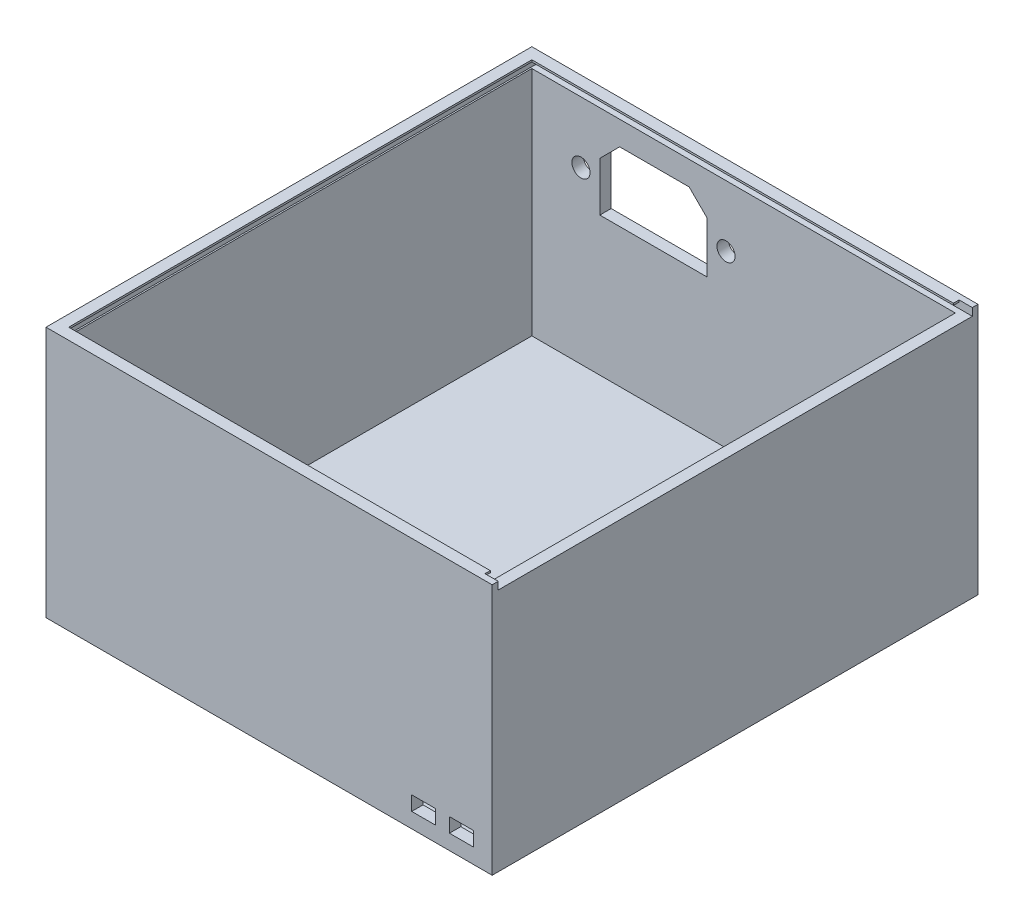
ISO-10303-21;
HEADER;
FILE_DESCRIPTION(('STEP AP214'),'2;1');
FILE_NAME('part.step','',(''),(''),'','','');
FILE_SCHEMA(('AUTOMOTIVE_DESIGN { 1 0 10303 214 1 1 1 1 }'));
ENDSEC;
DATA;
#1=APPLICATION_CONTEXT('core data for automotive mechanical design processes');
#2=APPLICATION_PROTOCOL_DEFINITION('international standard','automotive_design',2000,#1);
#3=PRODUCT_CONTEXT('',#1,'mechanical');
#4=PRODUCT('Part','Part','',(#3));
#5=PRODUCT_RELATED_PRODUCT_CATEGORY('part','',(#4));
#6=PRODUCT_DEFINITION_FORMATION('','',#4);
#7=PRODUCT_DEFINITION_CONTEXT('part definition',#1,'design');
#8=PRODUCT_DEFINITION('design','',#6,#7);
#9=PRODUCT_DEFINITION_SHAPE('','',#8);
#10=(LENGTH_UNIT() NAMED_UNIT(*) SI_UNIT(.MILLI.,.METRE.));
#11=(NAMED_UNIT(*) PLANE_ANGLE_UNIT() SI_UNIT($,.RADIAN.));
#12=(NAMED_UNIT(*) SI_UNIT($,.STERADIAN.) SOLID_ANGLE_UNIT());
#13=UNCERTAINTY_MEASURE_WITH_UNIT(LENGTH_MEASURE(1.E-05),#10,'distance_accuracy_value','');
#14=(GEOMETRIC_REPRESENTATION_CONTEXT(3) GLOBAL_UNCERTAINTY_ASSIGNED_CONTEXT((#13)) GLOBAL_UNIT_ASSIGNED_CONTEXT((#10,
#11,#12)) REPRESENTATION_CONTEXT('',''));
#15=CARTESIAN_POINT('',(0.,0.,0.));
#16=DIRECTION('',(0.,0.,1.));
#17=DIRECTION('',(1.,0.,0.));
#18=AXIS2_PLACEMENT_3D('',#15,#16,#17);
#19=CARTESIAN_POINT('',(56.05,3.3,-61.3));
#20=DIRECTION('',(0.,0.,-1.));
#21=DIRECTION('',(-1.,0.,0.));
#22=AXIS2_PLACEMENT_3D('',#19,#20,#21);
#23=PLANE('',#22);
#24=DIRECTION('',(1.,0.,0.));
#25=VECTOR('',#24,1.);
#26=CARTESIAN_POINT('',(56.05,66.0999999999999,-61.3));
#27=LINE('',#26,#25);
#28=CARTESIAN_POINT('',(-56.05,66.0999999999999,-61.3));
#29=VERTEX_POINT('',#28);
#30=CARTESIAN_POINT('',(55.55,66.0999999999999,-61.3));
#31=VERTEX_POINT('',#30);
#32=EDGE_CURVE('E342',#29,#31,#27,.T.);
#33=ORIENTED_EDGE('',*,*,#32,.T.);
#34=DIRECTION('',(0.,1.,0.));
#35=VECTOR('',#34,1.);
#36=CARTESIAN_POINT('',(55.55,3.3,-61.3));
#37=LINE('',#36,#35);
#38=CARTESIAN_POINT('',(55.55,66.6,-61.3));
#39=VERTEX_POINT('',#38);
#40=EDGE_CURVE('E54',#31,#39,#37,.T.);
#41=ORIENTED_EDGE('',*,*,#40,.T.);
#42=DIRECTION('',(-1.,0.,0.));
#43=VECTOR('',#42,1.);
#44=CARTESIAN_POINT('',(56.05,66.6,-61.3));
#45=LINE('',#44,#43);
#46=CARTESIAN_POINT('',(-56.05,66.6,-61.3));
#47=VERTEX_POINT('',#46);
#48=EDGE_CURVE('E270',#39,#47,#45,.T.);
#49=ORIENTED_EDGE('',*,*,#48,.T.);
#50=DIRECTION('',(0.,1.,0.));
#51=VECTOR('',#50,1.);
#52=CARTESIAN_POINT('',(-56.05,3.3,-61.3));
#53=LINE('',#52,#51);
#54=EDGE_CURVE('E387',#29,#47,#53,.T.);
#55=ORIENTED_EDGE('',*,*,#54,.F.);
#56=EDGE_LOOP('',(#33,#41,#49,#55));
#57=FACE_BOUND('',#56,.T.);
#58=ADVANCED_FACE('F38',(#57),#23,.F.);
#59=CARTESIAN_POINT('',(-56.05,3.3,61.3));
#60=DIRECTION('',(0.,0.,1.));
#61=DIRECTION('',(1.,0.,0.));
#62=AXIS2_PLACEMENT_3D('',#59,#60,#61);
#63=PLANE('',#62);
#64=DIRECTION('',(1.,0.,0.));
#65=VECTOR('',#64,1.);
#66=CARTESIAN_POINT('',(-56.05,66.6,61.3));
#67=LINE('',#66,#65);
#68=CARTESIAN_POINT('',(-56.05,66.6,61.3));
#69=VERTEX_POINT('',#68);
#70=CARTESIAN_POINT('',(55.55,66.6,61.3));
#71=VERTEX_POINT('',#70);
#72=EDGE_CURVE('E350',#69,#71,#67,.T.);
#73=ORIENTED_EDGE('',*,*,#72,.T.);
#74=DIRECTION('',(0.,-1.,0.));
#75=VECTOR('',#74,1.);
#76=CARTESIAN_POINT('',(55.55,3.3,61.3));
#77=LINE('',#76,#75);
#78=CARTESIAN_POINT('',(55.55,66.1,61.3));
#79=VERTEX_POINT('',#78);
#80=EDGE_CURVE('E282',#71,#79,#77,.T.);
#81=ORIENTED_EDGE('',*,*,#80,.T.);
#82=DIRECTION('',(-1.,0.,0.));
#83=VECTOR('',#82,1.);
#84=CARTESIAN_POINT('',(-56.05,66.1,61.3));
#85=LINE('',#84,#83);
#86=CARTESIAN_POINT('',(-56.05,66.1,61.3));
#87=VERTEX_POINT('',#86);
#88=EDGE_CURVE('E339',#79,#87,#85,.T.);
#89=ORIENTED_EDGE('',*,*,#88,.T.);
#90=DIRECTION('',(0.,1.,0.));
#91=VECTOR('',#90,1.);
#92=CARTESIAN_POINT('',(-56.05,3.3,61.3));
#93=LINE('',#92,#91);
#94=EDGE_CURVE('E382',#87,#69,#93,.T.);
#95=ORIENTED_EDGE('',*,*,#94,.T.);
#96=EDGE_LOOP('',(#73,#81,#89,#95));
#97=FACE_BOUND('',#96,.T.);
#98=ADVANCED_FACE('F659',(#97),#63,.F.);
#99=CARTESIAN_POINT('',(-56.05,3.3,-61.3));
#100=DIRECTION('',(-1.,0.,0.));
#101=DIRECTION('',(0.,0.,1.));
#102=AXIS2_PLACEMENT_3D('',#99,#100,#101);
#103=PLANE('',#102);
#104=ORIENTED_EDGE('',*,*,#94,.F.);
#105=DIRECTION('',(0.,0.,-1.));
#106=VECTOR('',#105,1.);
#107=CARTESIAN_POINT('',(-56.05,66.0999999999999,-61.3));
#108=LINE('',#107,#106);
#109=EDGE_CURVE('E346',#87,#29,#108,.T.);
#110=ORIENTED_EDGE('',*,*,#109,.T.);
#111=ORIENTED_EDGE('',*,*,#54,.T.);
#112=DIRECTION('',(0.,0.,1.));
#113=VECTOR('',#112,1.);
#114=CARTESIAN_POINT('',(-56.05,66.6,-61.3));
#115=LINE('',#114,#113);
#116=EDGE_CURVE('E356',#47,#69,#115,.T.);
#117=ORIENTED_EDGE('',*,*,#116,.T.);
#118=EDGE_LOOP('',(#104,#110,#111,#117));
#119=FACE_BOUND('',#118,.T.);
#120=ADVANCED_FACE('F665',(#119),#103,.F.);
#121=CARTESIAN_POINT('',(59.05,66.6,-64.3));
#122=DIRECTION('',(-1.,0.,0.));
#123=DIRECTION('',(0.,0.,1.));
#124=AXIS2_PLACEMENT_3D('',#121,#122,#123);
#125=PLANE('',#124);
#126=DIRECTION('',(0.,-1.,0.));
#127=VECTOR('',#126,1.);
#128=CARTESIAN_POINT('',(59.05,64.5999999999999,62.7));
#129=LINE('',#128,#127);
#130=CARTESIAN_POINT('',(59.05,66.6,62.7));
#131=VERTEX_POINT('',#130);
#132=CARTESIAN_POINT('',(59.05,64.5999999999999,62.7));
#133=VERTEX_POINT('',#132);
#134=EDGE_CURVE('E288',#131,#133,#129,.T.);
#135=ORIENTED_EDGE('',*,*,#134,.F.);
#136=DIRECTION('',(0.,0.,-1.));
#137=VECTOR('',#136,1.);
#138=CARTESIAN_POINT('',(59.05,66.6,-64.3));
#139=LINE('',#138,#137);
#140=CARTESIAN_POINT('',(59.05,66.6,64.3));
#141=VERTEX_POINT('',#140);
#142=EDGE_CURVE('E558',#141,#131,#139,.T.);
#143=ORIENTED_EDGE('',*,*,#142,.F.);
#144=DIRECTION('',(0.,-1.,0.));
#145=VECTOR('',#144,1.);
#146=CARTESIAN_POINT('',(59.05,66.6,64.3));
#147=LINE('',#146,#145);
#148=CARTESIAN_POINT('',(59.05,0.,64.3));
#149=VERTEX_POINT('',#148);
#150=EDGE_CURVE('E572',#141,#149,#147,.T.);
#151=ORIENTED_EDGE('',*,*,#150,.T.);
#152=DIRECTION('',(0.,0.,-1.));
#153=VECTOR('',#152,1.);
#154=CARTESIAN_POINT('',(59.05,0.,-64.3));
#155=LINE('',#154,#153);
#156=CARTESIAN_POINT('',(59.05,0.,-64.3));
#157=VERTEX_POINT('',#156);
#158=EDGE_CURVE('E543',#149,#157,#155,.T.);
#159=ORIENTED_EDGE('',*,*,#158,.T.);
#160=DIRECTION('',(0.,-1.,0.));
#161=VECTOR('',#160,1.);
#162=CARTESIAN_POINT('',(59.05,66.6,-64.3));
#163=LINE('',#162,#161);
#164=CARTESIAN_POINT('',(59.05,66.6,-64.3));
#165=VERTEX_POINT('',#164);
#166=EDGE_CURVE('E596',#165,#157,#163,.T.);
#167=ORIENTED_EDGE('',*,*,#166,.F.);
#168=CARTESIAN_POINT('',(59.05,66.6,-62.8));
#169=VERTEX_POINT('',#168);
#170=EDGE_CURVE('E563',#169,#165,#139,.T.);
#171=ORIENTED_EDGE('',*,*,#170,.F.);
#172=DIRECTION('',(0.,1.,0.));
#173=VECTOR('',#172,1.);
#174=CARTESIAN_POINT('',(59.05,64.5999999999999,-62.8));
#175=LINE('',#174,#173);
#176=CARTESIAN_POINT('',(59.05,64.5999999999999,-62.8));
#177=VERTEX_POINT('',#176);
#178=EDGE_CURVE('E261',#177,#169,#175,.T.);
#179=ORIENTED_EDGE('',*,*,#178,.F.);
#180=DIRECTION('',(0.,0.,-1.));
#181=VECTOR('',#180,1.);
#182=CARTESIAN_POINT('',(59.05,64.5999999999999,62.7));
#183=LINE('',#182,#181);
#184=EDGE_CURVE('E308',#133,#177,#183,.T.);
#185=ORIENTED_EDGE('',*,*,#184,.F.);
#186=EDGE_LOOP('',(#135,#143,#151,#159,#167,#171,#179,#185));
#187=FACE_BOUND('',#186,.T.);
#188=ADVANCED_FACE('F40',(#187),#125,.F.);
#189=CARTESIAN_POINT('',(-59.05,66.6,-64.3));
#190=DIRECTION('',(0.,0.,1.));
#191=DIRECTION('',(1.,0.,0.));
#192=AXIS2_PLACEMENT_3D('',#189,#190,#191);
#193=PLANE('',#192);
#194=CARTESIAN_POINT('',(-4.65000000000013,48.4,-64.3));
#195=DIRECTION('',(0.,0.,-1.));
#196=DIRECTION('',(-1.,0.,0.));
#197=AXIS2_PLACEMENT_3D('',#194,#195,#196);
#198=CIRCLE('',#197,2.4);
#199=CARTESIAN_POINT('',(-7.05000000000013,48.4,-64.3));
#200=VERTEX_POINT('',#199);
#201=EDGE_CURVE('E473',#200,#200,#198,.T.);
#202=ORIENTED_EDGE('',*,*,#201,.F.);
#203=EDGE_LOOP('',(#202));
#204=FACE_BOUND('',#203,.T.);
#205=CARTESIAN_POINT('',(-43.05,48.4,-64.3));
#206=DIRECTION('',(0.,0.,-1.));
#207=DIRECTION('',(-1.,0.,0.));
#208=AXIS2_PLACEMENT_3D('',#205,#206,#207);
#209=CIRCLE('',#208,2.40000000000001);
#210=CARTESIAN_POINT('',(-45.45,48.4,-64.3));
#211=VERTEX_POINT('',#210);
#212=EDGE_CURVE('E508',#211,#211,#209,.T.);
#213=ORIENTED_EDGE('',*,*,#212,.F.);
#214=EDGE_LOOP('',(#213));
#215=FACE_BOUND('',#214,.T.);
#216=DIRECTION('',(-1.,0.,0.));
#217=VECTOR('',#216,1.);
#218=CARTESIAN_POINT('',(-9.65000000000013,40.,-64.3));
#219=LINE('',#218,#217);
#220=CARTESIAN_POINT('',(-9.65000000000013,40.,-64.3));
#221=VERTEX_POINT('',#220);
#222=CARTESIAN_POINT('',(-38.05,40.,-64.3));
#223=VERTEX_POINT('',#222);
#224=EDGE_CURVE('E519',#221,#223,#219,.T.);
#225=ORIENTED_EDGE('',*,*,#224,.F.);
#226=DIRECTION('',(0.,-1.,0.));
#227=VECTOR('',#226,1.);
#228=CARTESIAN_POINT('',(-9.65000000000013,40.,-64.3));
#229=LINE('',#228,#227);
#230=CARTESIAN_POINT('',(-9.65000000000013,53.5169600949815,-64.3));
#231=VERTEX_POINT('',#230);
#232=EDGE_CURVE('E512',#231,#221,#229,.T.);
#233=ORIENTED_EDGE('',*,*,#232,.F.);
#234=DIRECTION('',(0.707106781186549,-0.707106781186546,0.));
#235=VECTOR('',#234,1.);
#236=CARTESIAN_POINT('',(-14.4000000000001,58.2669600949815,-64.3));
#237=LINE('',#236,#235);
#238=CARTESIAN_POINT('',(-14.4000000000001,58.2669600949815,-64.3));
#239=VERTEX_POINT('',#238);
#240=EDGE_CURVE('E535',#239,#231,#237,.T.);
#241=ORIENTED_EDGE('',*,*,#240,.F.);
#242=DIRECTION('',(1.,0.,0.));
#243=VECTOR('',#242,1.);
#244=CARTESIAN_POINT('',(-14.4000000000001,58.2669600949815,-64.3));
#245=LINE('',#244,#243);
#246=CARTESIAN_POINT('',(-32.8000000000001,58.2669600949815,-64.3));
#247=VERTEX_POINT('',#246);
#248=EDGE_CURVE('E531',#247,#239,#245,.T.);
#249=ORIENTED_EDGE('',*,*,#248,.F.);
#250=DIRECTION('',(0.707106781186546,0.707106781186549,0.));
#251=VECTOR('',#250,1.);
#252=CARTESIAN_POINT('',(-32.8000000000001,58.2669600949815,-64.3));
#253=LINE('',#252,#251);
#254=CARTESIAN_POINT('',(-38.05,53.0169600949816,-64.3));
#255=VERTEX_POINT('',#254);
#256=EDGE_CURVE('E527',#255,#247,#253,.T.);
#257=ORIENTED_EDGE('',*,*,#256,.F.);
#258=DIRECTION('',(0.,1.,0.));
#259=VECTOR('',#258,1.);
#260=CARTESIAN_POINT('',(-38.05,40.,-64.3));
#261=LINE('',#260,#259);
#262=EDGE_CURVE('E523',#223,#255,#261,.T.);
#263=ORIENTED_EDGE('',*,*,#262,.F.);
#264=EDGE_LOOP('',(#225,#233,#241,#249,#257,#263));
#265=FACE_BOUND('',#264,.T.);
#266=DIRECTION('',(-1.,0.,0.));
#267=VECTOR('',#266,1.);
#268=CARTESIAN_POINT('',(-59.05,0.,-64.3));
#269=LINE('',#268,#267);
#270=CARTESIAN_POINT('',(-59.05,0.,-64.3));
#271=VERTEX_POINT('',#270);
#272=EDGE_CURVE('E576',#157,#271,#269,.T.);
#273=ORIENTED_EDGE('',*,*,#272,.T.);
#274=DIRECTION('',(0.,-1.,0.));
#275=VECTOR('',#274,1.);
#276=CARTESIAN_POINT('',(-59.05,66.6,-64.3));
#277=LINE('',#276,#275);
#278=CARTESIAN_POINT('',(-59.05,66.6,-64.3));
#279=VERTEX_POINT('',#278);
#280=EDGE_CURVE('E592',#279,#271,#277,.T.);
#281=ORIENTED_EDGE('',*,*,#280,.F.);
#282=DIRECTION('',(-1.,0.,0.));
#283=VECTOR('',#282,1.);
#284=CARTESIAN_POINT('',(-59.05,66.6,-64.3));
#285=LINE('',#284,#283);
#286=EDGE_CURVE('E562',#165,#279,#285,.T.);
#287=ORIENTED_EDGE('',*,*,#286,.F.);
#288=ORIENTED_EDGE('',*,*,#166,.T.);
#289=EDGE_LOOP('',(#273,#281,#287,#288));
#290=FACE_BOUND('',#289,.T.);
#291=ADVANCED_FACE('F631',(#204,#215,#265,#290),#193,.F.);
#292=CARTESIAN_POINT('',(-59.05,66.6,-64.3));
#293=DIRECTION('',(1.,0.,0.));
#294=DIRECTION('',(0.,0.,-1.));
#295=AXIS2_PLACEMENT_3D('',#292,#293,#294);
#296=PLANE('',#295);
#297=DIRECTION('',(0.,0.,1.));
#298=VECTOR('',#297,1.);
#299=CARTESIAN_POINT('',(-59.05,0.,-64.3));
#300=LINE('',#299,#298);
#301=CARTESIAN_POINT('',(-59.05,0.,64.3));
#302=VERTEX_POINT('',#301);
#303=EDGE_CURVE('E579',#271,#302,#300,.T.);
#304=ORIENTED_EDGE('',*,*,#303,.T.);
#305=DIRECTION('',(0.,-1.,0.));
#306=VECTOR('',#305,1.);
#307=CARTESIAN_POINT('',(-59.05,66.6,64.3));
#308=LINE('',#307,#306);
#309=CARTESIAN_POINT('',(-59.05,66.6,64.3));
#310=VERTEX_POINT('',#309);
#311=EDGE_CURVE('E588',#310,#302,#308,.T.);
#312=ORIENTED_EDGE('',*,*,#311,.F.);
#313=DIRECTION('',(0.,0.,1.));
#314=VECTOR('',#313,1.);
#315=CARTESIAN_POINT('',(-59.05,66.6,-64.3));
#316=LINE('',#315,#314);
#317=EDGE_CURVE('E566',#279,#310,#316,.T.);
#318=ORIENTED_EDGE('',*,*,#317,.F.);
#319=ORIENTED_EDGE('',*,*,#280,.T.);
#320=EDGE_LOOP('',(#304,#312,#318,#319));
#321=FACE_BOUND('',#320,.T.);
#322=ADVANCED_FACE('F917',(#321),#296,.F.);
#323=CARTESIAN_POINT('',(-59.05,66.6,64.3));
#324=DIRECTION('',(0.,0.,-1.));
#325=DIRECTION('',(-1.,0.,0.));
#326=AXIS2_PLACEMENT_3D('',#323,#324,#325);
#327=PLANE('',#326);
#328=DIRECTION('',(1.,0.,0.));
#329=VECTOR('',#328,1.);
#330=CARTESIAN_POINT('',(47.75,4.,64.3));
#331=LINE('',#330,#329);
#332=CARTESIAN_POINT('',(47.75,4.,64.3));
#333=VERTEX_POINT('',#332);
#334=CARTESIAN_POINT('',(54.05,4.,64.3));
#335=VERTEX_POINT('',#334);
#336=EDGE_CURVE('E456',#333,#335,#331,.T.);
#337=ORIENTED_EDGE('',*,*,#336,.F.);
#338=DIRECTION('',(0.,-1.,0.));
#339=VECTOR('',#338,1.);
#340=CARTESIAN_POINT('',(47.75,4.,64.3));
#341=LINE('',#340,#339);
#342=CARTESIAN_POINT('',(47.75,7.8,64.3));
#343=VERTEX_POINT('',#342);
#344=EDGE_CURVE('E452',#343,#333,#341,.T.);
#345=ORIENTED_EDGE('',*,*,#344,.F.);
#346=DIRECTION('',(-1.,0.,0.));
#347=VECTOR('',#346,1.);
#348=CARTESIAN_POINT('',(47.75,7.8,64.3));
#349=LINE('',#348,#347);
#350=CARTESIAN_POINT('',(54.05,7.8,64.3));
#351=VERTEX_POINT('',#350);
#352=EDGE_CURVE('E465',#351,#343,#349,.T.);
#353=ORIENTED_EDGE('',*,*,#352,.F.);
#354=DIRECTION('',(0.,1.,0.));
#355=VECTOR('',#354,1.);
#356=CARTESIAN_POINT('',(54.05,4.,64.3));
#357=LINE('',#356,#355);
#358=EDGE_CURVE('E461',#335,#351,#357,.T.);
#359=ORIENTED_EDGE('',*,*,#358,.F.);
#360=EDGE_LOOP('',(#337,#345,#353,#359));
#361=FACE_BOUND('',#360,.T.);
#362=DIRECTION('',(1.,0.,0.));
#363=VECTOR('',#362,1.);
#364=CARTESIAN_POINT('',(37.75,4.,64.3));
#365=LINE('',#364,#363);
#366=CARTESIAN_POINT('',(37.75,4.,64.3));
#367=VERTEX_POINT('',#366);
#368=CARTESIAN_POINT('',(44.05,4.,64.3));
#369=VERTEX_POINT('',#368);
#370=EDGE_CURVE('E485',#367,#369,#365,.T.);
#371=ORIENTED_EDGE('',*,*,#370,.F.);
#372=DIRECTION('',(0.,-1.,0.));
#373=VECTOR('',#372,1.);
#374=CARTESIAN_POINT('',(37.75,4.,64.3));
#375=LINE('',#374,#373);
#376=CARTESIAN_POINT('',(37.75,7.8,64.3));
#377=VERTEX_POINT('',#376);
#378=EDGE_CURVE('E451',#377,#367,#375,.T.);
#379=ORIENTED_EDGE('',*,*,#378,.F.);
#380=DIRECTION('',(-1.,0.,0.));
#381=VECTOR('',#380,1.);
#382=CARTESIAN_POINT('',(37.75,7.8,64.3));
#383=LINE('',#382,#381);
#384=CARTESIAN_POINT('',(44.05,7.8,64.3));
#385=VERTEX_POINT('',#384);
#386=EDGE_CURVE('E493',#385,#377,#383,.T.);
#387=ORIENTED_EDGE('',*,*,#386,.F.);
#388=DIRECTION('',(0.,1.,0.));
#389=VECTOR('',#388,1.);
#390=CARTESIAN_POINT('',(44.05,4.,64.3));
#391=LINE('',#390,#389);
#392=EDGE_CURVE('E489',#369,#385,#391,.T.);
#393=ORIENTED_EDGE('',*,*,#392,.F.);
#394=EDGE_LOOP('',(#371,#379,#387,#393));
#395=FACE_BOUND('',#394,.T.);
#396=DIRECTION('',(1.,0.,0.));
#397=VECTOR('',#396,1.);
#398=CARTESIAN_POINT('',(-59.05,0.,64.3));
#399=LINE('',#398,#397);
#400=EDGE_CURVE('E582',#302,#149,#399,.T.);
#401=ORIENTED_EDGE('',*,*,#400,.T.);
#402=ORIENTED_EDGE('',*,*,#150,.F.);
#403=DIRECTION('',(1.,0.,0.));
#404=VECTOR('',#403,1.);
#405=CARTESIAN_POINT('',(-59.05,66.6,64.3));
#406=LINE('',#405,#404);
#407=EDGE_CURVE('E569',#310,#141,#406,.T.);
#408=ORIENTED_EDGE('',*,*,#407,.F.);
#409=ORIENTED_EDGE('',*,*,#311,.T.);
#410=EDGE_LOOP('',(#401,#402,#408,#409));
#411=FACE_BOUND('',#410,.T.);
#412=ADVANCED_FACE('F920',(#361,#395,#411),#327,.F.);
#413=CARTESIAN_POINT('',(0.,66.6,0.));
#414=DIRECTION('',(0.,1.,0.));
#415=DIRECTION('',(0.,0.,1.));
#416=AXIS2_PLACEMENT_3D('',#413,#414,#415);
#417=PLANE('',#416);
#418=DIRECTION('',(1.,0.,0.));
#419=VECTOR('',#418,1.);
#420=CARTESIAN_POINT('',(55.55,66.6,-62.8));
#421=LINE('',#420,#419);
#422=CARTESIAN_POINT('',(55.55,66.6,-62.8));
#423=VERTEX_POINT('',#422);
#424=EDGE_CURVE('E258',#423,#169,#421,.T.);
#425=ORIENTED_EDGE('',*,*,#424,.T.);
#426=ORIENTED_EDGE('',*,*,#170,.T.);
#427=ORIENTED_EDGE('',*,*,#286,.T.);
#428=ORIENTED_EDGE('',*,*,#317,.T.);
#429=ORIENTED_EDGE('',*,*,#407,.T.);
#430=ORIENTED_EDGE('',*,*,#142,.T.);
#431=DIRECTION('',(1.,0.,0.));
#432=VECTOR('',#431,1.);
#433=CARTESIAN_POINT('',(55.55,66.6,62.7));
#434=LINE('',#433,#432);
#435=CARTESIAN_POINT('',(55.55,66.6,62.7));
#436=VERTEX_POINT('',#435);
#437=EDGE_CURVE('E265',#436,#131,#434,.T.);
#438=ORIENTED_EDGE('',*,*,#437,.F.);
#439=DIRECTION('',(0.,0.,1.));
#440=VECTOR('',#439,1.);
#441=CARTESIAN_POINT('',(55.55,66.6,62.7));
#442=LINE('',#441,#440);
#443=EDGE_CURVE('E255',#71,#436,#442,.T.);
#444=ORIENTED_EDGE('',*,*,#443,.F.);
#445=ORIENTED_EDGE('',*,*,#72,.F.);
#446=ORIENTED_EDGE('',*,*,#116,.F.);
#447=ORIENTED_EDGE('',*,*,#48,.F.);
#448=EDGE_CURVE('E250',#423,#39,#442,.T.);
#449=ORIENTED_EDGE('',*,*,#448,.F.);
#450=EDGE_LOOP('',(#425,#426,#427,#428,#429,#430,#438,#444,#445,#446,#447,#449));
#451=FACE_BOUND('',#450,.T.);
#452=ADVANCED_FACE('F268',(#451),#417,.T.);
#453=CARTESIAN_POINT('',(0.,0.,0.));
#454=DIRECTION('',(0.,1.,0.));
#455=DIRECTION('',(0.,0.,1.));
#456=AXIS2_PLACEMENT_3D('',#453,#454,#455);
#457=PLANE('',#456);
#458=ORIENTED_EDGE('',*,*,#158,.F.);
#459=ORIENTED_EDGE('',*,*,#400,.F.);
#460=ORIENTED_EDGE('',*,*,#303,.F.);
#461=ORIENTED_EDGE('',*,*,#272,.F.);
#462=EDGE_LOOP('',(#458,#459,#460,#461));
#463=FACE_BOUND('',#462,.T.);
#464=ADVANCED_FACE('F647',(#463),#457,.F.);
#465=CARTESIAN_POINT('',(-9.65000000000013,40.,-60.3));
#466=DIRECTION('',(1.,0.,0.));
#467=DIRECTION('',(0.,1.,0.));
#468=AXIS2_PLACEMENT_3D('',#465,#466,#467);
#469=PLANE('',#468);
#470=DIRECTION('',(0.,0.,-1.));
#471=VECTOR('',#470,1.);
#472=CARTESIAN_POINT('',(-9.65000000000013,40.,-60.3));
#473=LINE('',#472,#471);
#474=CARTESIAN_POINT('',(-9.65000000000013,40.,-61.3));
#475=VERTEX_POINT('',#474);
#476=EDGE_CURVE('E539',#475,#221,#473,.T.);
#477=ORIENTED_EDGE('',*,*,#476,.F.);
#478=DIRECTION('',(0.,1.,0.));
#479=VECTOR('',#478,1.);
#480=CARTESIAN_POINT('',(-9.65000000000013,40.,-61.3));
#481=LINE('',#480,#479);
#482=CARTESIAN_POINT('',(-9.65000000000013,53.5169600949815,-61.3));
#483=VERTEX_POINT('',#482);
#484=EDGE_CURVE('E447',#475,#483,#481,.T.);
#485=ORIENTED_EDGE('',*,*,#484,.T.);
#486=DIRECTION('',(0.,0.,-1.));
#487=VECTOR('',#486,1.);
#488=CARTESIAN_POINT('',(-9.65000000000013,53.5169600949815,-60.3));
#489=LINE('',#488,#487);
#490=EDGE_CURVE('E540',#483,#231,#489,.T.);
#491=ORIENTED_EDGE('',*,*,#490,.T.);
#492=ORIENTED_EDGE('',*,*,#232,.T.);
#493=EDGE_LOOP('',(#477,#485,#491,#492));
#494=FACE_BOUND('',#493,.T.);
#495=ADVANCED_FACE('F645',(#494),#469,.F.);
#496=CARTESIAN_POINT('',(-14.4000000000001,58.2669600949815,-60.3));
#497=DIRECTION('',(0.707106781186546,0.707106781186549,0.));
#498=DIRECTION('',(-0.707106781186549,0.707106781186546,0.));
#499=AXIS2_PLACEMENT_3D('',#496,#497,#498);
#500=PLANE('',#499);
#501=ORIENTED_EDGE('',*,*,#490,.F.);
#502=DIRECTION('',(-0.707106781186549,0.707106781186546,0.));
#503=VECTOR('',#502,1.);
#504=CARTESIAN_POINT('',(-14.4000000000001,58.2669600949815,-61.3));
#505=LINE('',#504,#503);
#506=CARTESIAN_POINT('',(-14.4000000000001,58.2669600949815,-61.3));
#507=VERTEX_POINT('',#506);
#508=EDGE_CURVE('E443',#483,#507,#505,.T.);
#509=ORIENTED_EDGE('',*,*,#508,.T.);
#510=DIRECTION('',(0.,0.,-1.));
#511=VECTOR('',#510,1.);
#512=CARTESIAN_POINT('',(-14.4000000000001,58.2669600949815,-60.3));
#513=LINE('',#512,#511);
#514=EDGE_CURVE('E544',#507,#239,#513,.T.);
#515=ORIENTED_EDGE('',*,*,#514,.T.);
#516=ORIENTED_EDGE('',*,*,#240,.T.);
#517=EDGE_LOOP('',(#501,#509,#515,#516));
#518=FACE_BOUND('',#517,.T.);
#519=ADVANCED_FACE('F643',(#518),#500,.F.);
#520=CARTESIAN_POINT('',(-14.4000000000001,58.2669600949815,-60.3));
#521=DIRECTION('',(0.,1.,0.));
#522=DIRECTION('',(0.,0.,1.));
#523=AXIS2_PLACEMENT_3D('',#520,#521,#522);
#524=PLANE('',#523);
#525=ORIENTED_EDGE('',*,*,#514,.F.);
#526=DIRECTION('',(-1.,0.,0.));
#527=VECTOR('',#526,1.);
#528=CARTESIAN_POINT('',(-14.4000000000001,58.2669600949815,-61.3));
#529=LINE('',#528,#527);
#530=CARTESIAN_POINT('',(-32.8000000000001,58.2669600949815,-61.3));
#531=VERTEX_POINT('',#530);
#532=EDGE_CURVE('E439',#507,#531,#529,.T.);
#533=ORIENTED_EDGE('',*,*,#532,.T.);
#534=DIRECTION('',(0.,0.,-1.));
#535=VECTOR('',#534,1.);
#536=CARTESIAN_POINT('',(-32.8000000000001,58.2669600949815,-60.3));
#537=LINE('',#536,#535);
#538=EDGE_CURVE('E547',#531,#247,#537,.T.);
#539=ORIENTED_EDGE('',*,*,#538,.T.);
#540=ORIENTED_EDGE('',*,*,#248,.T.);
#541=EDGE_LOOP('',(#525,#533,#539,#540));
#542=FACE_BOUND('',#541,.T.);
#543=ADVANCED_FACE('F640',(#542),#524,.F.);
#544=CARTESIAN_POINT('',(-32.8000000000001,58.2669600949815,-60.3));
#545=DIRECTION('',(-0.70710678118655,0.707106781186546,0.));
#546=DIRECTION('',(-0.707106781186546,-0.70710678118655,0.));
#547=AXIS2_PLACEMENT_3D('',#544,#545,#546);
#548=PLANE('',#547);
#549=ORIENTED_EDGE('',*,*,#538,.F.);
#550=DIRECTION('',(-0.707106781186546,-0.70710678118655,0.));
#551=VECTOR('',#550,1.);
#552=CARTESIAN_POINT('',(-32.8000000000001,58.2669600949815,-61.3));
#553=LINE('',#552,#551);
#554=CARTESIAN_POINT('',(-38.05,53.0169600949816,-61.3));
#555=VERTEX_POINT('',#554);
#556=EDGE_CURVE('E435',#531,#555,#553,.T.);
#557=ORIENTED_EDGE('',*,*,#556,.T.);
#558=DIRECTION('',(0.,0.,-1.));
#559=VECTOR('',#558,1.);
#560=CARTESIAN_POINT('',(-38.05,53.0169600949816,-60.3));
#561=LINE('',#560,#559);
#562=EDGE_CURVE('E550',#555,#255,#561,.T.);
#563=ORIENTED_EDGE('',*,*,#562,.T.);
#564=ORIENTED_EDGE('',*,*,#256,.T.);
#565=EDGE_LOOP('',(#549,#557,#563,#564));
#566=FACE_BOUND('',#565,.T.);
#567=ADVANCED_FACE('F637',(#566),#548,.F.);
#568=CARTESIAN_POINT('',(-38.05,40.,-60.3));
#569=DIRECTION('',(-1.,0.,0.));
#570=DIRECTION('',(0.,0.,1.));
#571=AXIS2_PLACEMENT_3D('',#568,#569,#570);
#572=PLANE('',#571);
#573=ORIENTED_EDGE('',*,*,#562,.F.);
#574=DIRECTION('',(0.,-1.,0.));
#575=VECTOR('',#574,1.);
#576=CARTESIAN_POINT('',(-38.05,40.,-61.3));
#577=LINE('',#576,#575);
#578=CARTESIAN_POINT('',(-38.05,40.,-61.3));
#579=VERTEX_POINT('',#578);
#580=EDGE_CURVE('E431',#555,#579,#577,.T.);
#581=ORIENTED_EDGE('',*,*,#580,.T.);
#582=DIRECTION('',(0.,0.,-1.));
#583=VECTOR('',#582,1.);
#584=CARTESIAN_POINT('',(-38.05,40.,-60.3));
#585=LINE('',#584,#583);
#586=EDGE_CURVE('E553',#579,#223,#585,.T.);
#587=ORIENTED_EDGE('',*,*,#586,.T.);
#588=ORIENTED_EDGE('',*,*,#262,.T.);
#589=EDGE_LOOP('',(#573,#581,#587,#588));
#590=FACE_BOUND('',#589,.T.);
#591=ADVANCED_FACE('F624',(#590),#572,.F.);
#592=CARTESIAN_POINT('',(-9.65000000000013,40.,-60.3));
#593=DIRECTION('',(0.,-1.,0.));
#594=DIRECTION('',(1.,0.,0.));
#595=AXIS2_PLACEMENT_3D('',#592,#593,#594);
#596=PLANE('',#595);
#597=ORIENTED_EDGE('',*,*,#586,.F.);
#598=DIRECTION('',(1.,0.,0.));
#599=VECTOR('',#598,1.);
#600=CARTESIAN_POINT('',(-9.65000000000013,40.,-61.3));
#601=LINE('',#600,#599);
#602=EDGE_CURVE('E427',#579,#475,#601,.T.);
#603=ORIENTED_EDGE('',*,*,#602,.T.);
#604=ORIENTED_EDGE('',*,*,#476,.T.);
#605=ORIENTED_EDGE('',*,*,#224,.T.);
#606=EDGE_LOOP('',(#597,#603,#604,#605));
#607=FACE_BOUND('',#606,.T.);
#608=ADVANCED_FACE('F625',(#607),#596,.F.);
#609=CARTESIAN_POINT('',(-43.05,48.4,-60.3));
#610=DIRECTION('',(0.,0.,-1.));
#611=DIRECTION('',(-1.,0.,0.));
#612=AXIS2_PLACEMENT_3D('',#609,#610,#611);
#613=CYLINDRICAL_SURFACE('',#612,2.40000000000001);
#614=CARTESIAN_POINT('',(-43.05,48.4,-61.3));
#615=DIRECTION('',(0.,0.,-1.));
#616=DIRECTION('',(-1.,0.,0.));
#617=AXIS2_PLACEMENT_3D('',#614,#615,#616);
#618=CIRCLE('',#617,2.40000000000001);
#619=CARTESIAN_POINT('',(-45.45,48.4,-61.3));
#620=VERTEX_POINT('',#619);
#621=EDGE_CURVE('E423',#620,#620,#618,.F.);
#622=ORIENTED_EDGE('',*,*,#621,.T.);
#623=EDGE_LOOP('',(#622));
#624=FACE_BOUND('',#623,.T.);
#625=ORIENTED_EDGE('',*,*,#212,.T.);
#626=EDGE_LOOP('',(#625));
#627=FACE_BOUND('',#626,.T.);
#628=ADVANCED_FACE('F710',(#624,#627),#613,.F.);
#629=CARTESIAN_POINT('',(-4.65000000000013,48.4,-60.3));
#630=DIRECTION('',(0.,0.,-1.));
#631=DIRECTION('',(-1.,0.,0.));
#632=AXIS2_PLACEMENT_3D('',#629,#630,#631);
#633=CYLINDRICAL_SURFACE('',#632,2.4);
#634=CARTESIAN_POINT('',(-4.65000000000013,48.4,-61.3));
#635=DIRECTION('',(0.,0.,-1.));
#636=DIRECTION('',(-1.,0.,0.));
#637=AXIS2_PLACEMENT_3D('',#634,#635,#636);
#638=CIRCLE('',#637,2.4);
#639=CARTESIAN_POINT('',(-7.05000000000013,48.4,-61.3));
#640=VERTEX_POINT('',#639);
#641=EDGE_CURVE('E422',#640,#640,#638,.F.);
#642=ORIENTED_EDGE('',*,*,#641,.T.);
#643=EDGE_LOOP('',(#642));
#644=FACE_BOUND('',#643,.T.);
#645=ORIENTED_EDGE('',*,*,#201,.T.);
#646=EDGE_LOOP('',(#645));
#647=FACE_BOUND('',#646,.T.);
#648=ADVANCED_FACE('F606',(#644,#647),#633,.F.);
#649=CARTESIAN_POINT('',(37.75,4.,60.3));
#650=DIRECTION('',(-1.,0.,0.));
#651=DIRECTION('',(0.,0.,1.));
#652=AXIS2_PLACEMENT_3D('',#649,#650,#651);
#653=PLANE('',#652);
#654=DIRECTION('',(0.,0.,1.));
#655=VECTOR('',#654,1.);
#656=CARTESIAN_POINT('',(37.75,4.,60.3));
#657=LINE('',#656,#655);
#658=CARTESIAN_POINT('',(37.75,4.,61.3));
#659=VERTEX_POINT('',#658);
#660=EDGE_CURVE('E497',#659,#367,#657,.T.);
#661=ORIENTED_EDGE('',*,*,#660,.F.);
#662=DIRECTION('',(0.,1.,0.));
#663=VECTOR('',#662,1.);
#664=CARTESIAN_POINT('',(37.75,4.,61.3));
#665=LINE('',#664,#663);
#666=CARTESIAN_POINT('',(37.75,7.8,61.3));
#667=VERTEX_POINT('',#666);
#668=EDGE_CURVE('E418',#659,#667,#665,.T.);
#669=ORIENTED_EDGE('',*,*,#668,.T.);
#670=DIRECTION('',(0.,0.,1.));
#671=VECTOR('',#670,1.);
#672=CARTESIAN_POINT('',(37.75,7.8,60.3));
#673=LINE('',#672,#671);
#674=EDGE_CURVE('E457',#667,#377,#673,.T.);
#675=ORIENTED_EDGE('',*,*,#674,.T.);
#676=ORIENTED_EDGE('',*,*,#378,.T.);
#677=EDGE_LOOP('',(#661,#669,#675,#676));
#678=FACE_BOUND('',#677,.T.);
#679=ADVANCED_FACE('F699',(#678),#653,.F.);
#680=CARTESIAN_POINT('',(37.75,7.8,60.3));
#681=DIRECTION('',(0.,1.,0.));
#682=DIRECTION('',(-1.,0.,0.));
#683=AXIS2_PLACEMENT_3D('',#680,#681,#682);
#684=PLANE('',#683);
#685=ORIENTED_EDGE('',*,*,#674,.F.);
#686=DIRECTION('',(1.,0.,0.));
#687=VECTOR('',#686,1.);
#688=CARTESIAN_POINT('',(37.75,7.8,61.3));
#689=LINE('',#688,#687);
#690=CARTESIAN_POINT('',(44.05,7.8,61.3));
#691=VERTEX_POINT('',#690);
#692=EDGE_CURVE('E414',#667,#691,#689,.T.);
#693=ORIENTED_EDGE('',*,*,#692,.T.);
#694=DIRECTION('',(0.,0.,1.));
#695=VECTOR('',#694,1.);
#696=CARTESIAN_POINT('',(44.05,7.8,60.3));
#697=LINE('',#696,#695);
#698=EDGE_CURVE('E500',#691,#385,#697,.T.);
#699=ORIENTED_EDGE('',*,*,#698,.T.);
#700=ORIENTED_EDGE('',*,*,#386,.T.);
#701=EDGE_LOOP('',(#685,#693,#699,#700));
#702=FACE_BOUND('',#701,.T.);
#703=ADVANCED_FACE('F695',(#702),#684,.F.);
#704=CARTESIAN_POINT('',(44.05,4.,60.3));
#705=DIRECTION('',(1.,0.,0.));
#706=DIRECTION('',(0.,0.,-1.));
#707=AXIS2_PLACEMENT_3D('',#704,#705,#706);
#708=PLANE('',#707);
#709=ORIENTED_EDGE('',*,*,#698,.F.);
#710=DIRECTION('',(0.,-1.,0.));
#711=VECTOR('',#710,1.);
#712=CARTESIAN_POINT('',(44.05,4.,61.3));
#713=LINE('',#712,#711);
#714=CARTESIAN_POINT('',(44.05,4.,61.3));
#715=VERTEX_POINT('',#714);
#716=EDGE_CURVE('E410',#691,#715,#713,.T.);
#717=ORIENTED_EDGE('',*,*,#716,.T.);
#718=DIRECTION('',(0.,0.,1.));
#719=VECTOR('',#718,1.);
#720=CARTESIAN_POINT('',(44.05,4.,60.3));
#721=LINE('',#720,#719);
#722=EDGE_CURVE('E503',#715,#369,#721,.T.);
#723=ORIENTED_EDGE('',*,*,#722,.T.);
#724=ORIENTED_EDGE('',*,*,#392,.T.);
#725=EDGE_LOOP('',(#709,#717,#723,#724));
#726=FACE_BOUND('',#725,.T.);
#727=ADVANCED_FACE('F698',(#726),#708,.F.);
#728=CARTESIAN_POINT('',(37.75,4.,60.3));
#729=DIRECTION('',(0.,-1.,0.));
#730=DIRECTION('',(0.,0.,-1.));
#731=AXIS2_PLACEMENT_3D('',#728,#729,#730);
#732=PLANE('',#731);
#733=ORIENTED_EDGE('',*,*,#722,.F.);
#734=DIRECTION('',(-1.,0.,0.));
#735=VECTOR('',#734,1.);
#736=CARTESIAN_POINT('',(37.75,4.,61.3));
#737=LINE('',#736,#735);
#738=EDGE_CURVE('E406',#715,#659,#737,.T.);
#739=ORIENTED_EDGE('',*,*,#738,.T.);
#740=ORIENTED_EDGE('',*,*,#660,.T.);
#741=ORIENTED_EDGE('',*,*,#370,.T.);
#742=EDGE_LOOP('',(#733,#739,#740,#741));
#743=FACE_BOUND('',#742,.T.);
#744=ADVANCED_FACE('F693',(#743),#732,.F.);
#745=CARTESIAN_POINT('',(47.75,4.,60.3));
#746=DIRECTION('',(-1.,0.,0.));
#747=DIRECTION('',(0.,0.,1.));
#748=AXIS2_PLACEMENT_3D('',#745,#746,#747);
#749=PLANE('',#748);
#750=DIRECTION('',(0.,0.,1.));
#751=VECTOR('',#750,1.);
#752=CARTESIAN_POINT('',(47.75,4.,60.3));
#753=LINE('',#752,#751);
#754=CARTESIAN_POINT('',(47.75,4.,61.3));
#755=VERTEX_POINT('',#754);
#756=EDGE_CURVE('E469',#755,#333,#753,.T.);
#757=ORIENTED_EDGE('',*,*,#756,.F.);
#758=DIRECTION('',(0.,1.,0.));
#759=VECTOR('',#758,1.);
#760=CARTESIAN_POINT('',(47.75,4.,61.3));
#761=LINE('',#760,#759);
#762=CARTESIAN_POINT('',(47.75,7.8,61.3));
#763=VERTEX_POINT('',#762);
#764=EDGE_CURVE('E402',#755,#763,#761,.T.);
#765=ORIENTED_EDGE('',*,*,#764,.T.);
#766=DIRECTION('',(0.,0.,1.));
#767=VECTOR('',#766,1.);
#768=CARTESIAN_POINT('',(47.75,7.8,60.3));
#769=LINE('',#768,#767);
#770=EDGE_CURVE('E470',#763,#343,#769,.T.);
#771=ORIENTED_EDGE('',*,*,#770,.T.);
#772=ORIENTED_EDGE('',*,*,#344,.T.);
#773=EDGE_LOOP('',(#757,#765,#771,#772));
#774=FACE_BOUND('',#773,.T.);
#775=ADVANCED_FACE('F683',(#774),#749,.F.);
#776=CARTESIAN_POINT('',(47.75,7.8,60.3));
#777=DIRECTION('',(0.,1.,0.));
#778=DIRECTION('',(-1.,0.,0.));
#779=AXIS2_PLACEMENT_3D('',#776,#777,#778);
#780=PLANE('',#779);
#781=ORIENTED_EDGE('',*,*,#770,.F.);
#782=DIRECTION('',(1.,0.,0.));
#783=VECTOR('',#782,1.);
#784=CARTESIAN_POINT('',(47.75,7.8,61.3));
#785=LINE('',#784,#783);
#786=CARTESIAN_POINT('',(54.05,7.8,61.3));
#787=VERTEX_POINT('',#786);
#788=EDGE_CURVE('E398',#763,#787,#785,.T.);
#789=ORIENTED_EDGE('',*,*,#788,.T.);
#790=DIRECTION('',(0.,0.,1.));
#791=VECTOR('',#790,1.);
#792=CARTESIAN_POINT('',(54.05,7.8,60.3));
#793=LINE('',#792,#791);
#794=EDGE_CURVE('E474',#787,#351,#793,.T.);
#795=ORIENTED_EDGE('',*,*,#794,.T.);
#796=ORIENTED_EDGE('',*,*,#352,.T.);
#797=EDGE_LOOP('',(#781,#789,#795,#796));
#798=FACE_BOUND('',#797,.T.);
#799=ADVANCED_FACE('F679',(#798),#780,.F.);
#800=CARTESIAN_POINT('',(54.05,4.,60.3));
#801=DIRECTION('',(1.,0.,0.));
#802=DIRECTION('',(0.,0.,-1.));
#803=AXIS2_PLACEMENT_3D('',#800,#801,#802);
#804=PLANE('',#803);
#805=ORIENTED_EDGE('',*,*,#794,.F.);
#806=DIRECTION('',(0.,-1.,0.));
#807=VECTOR('',#806,1.);
#808=CARTESIAN_POINT('',(54.05,4.,61.3));
#809=LINE('',#808,#807);
#810=CARTESIAN_POINT('',(54.05,4.,61.3));
#811=VERTEX_POINT('',#810);
#812=EDGE_CURVE('E381',#787,#811,#809,.T.);
#813=ORIENTED_EDGE('',*,*,#812,.T.);
#814=DIRECTION('',(0.,0.,1.));
#815=VECTOR('',#814,1.);
#816=CARTESIAN_POINT('',(54.05,4.,60.3));
#817=LINE('',#816,#815);
#818=EDGE_CURVE('E477',#811,#335,#817,.T.);
#819=ORIENTED_EDGE('',*,*,#818,.T.);
#820=ORIENTED_EDGE('',*,*,#358,.T.);
#821=EDGE_LOOP('',(#805,#813,#819,#820));
#822=FACE_BOUND('',#821,.T.);
#823=ADVANCED_FACE('F682',(#822),#804,.F.);
#824=CARTESIAN_POINT('',(47.75,4.,60.3));
#825=DIRECTION('',(0.,-1.,0.));
#826=DIRECTION('',(0.,0.,-1.));
#827=AXIS2_PLACEMENT_3D('',#824,#825,#826);
#828=PLANE('',#827);
#829=ORIENTED_EDGE('',*,*,#818,.F.);
#830=DIRECTION('',(-1.,0.,0.));
#831=VECTOR('',#830,1.);
#832=CARTESIAN_POINT('',(47.75,4.,61.3));
#833=LINE('',#832,#831);
#834=EDGE_CURVE('E47',#811,#755,#833,.T.);
#835=ORIENTED_EDGE('',*,*,#834,.T.);
#836=ORIENTED_EDGE('',*,*,#756,.T.);
#837=ORIENTED_EDGE('',*,*,#336,.T.);
#838=EDGE_LOOP('',(#829,#835,#836,#837));
#839=FACE_BOUND('',#838,.T.);
#840=ADVANCED_FACE('F613',(#839),#828,.F.);
#841=ORIENTED_EDGE('',*,*,#641,.F.);
#842=EDGE_LOOP('',(#841));
#843=FACE_BOUND('',#842,.T.);
#844=DIRECTION('',(0.,1.,0.));
#845=VECTOR('',#844,1.);
#846=CARTESIAN_POINT('',(56.05,3.3,-61.3));
#847=LINE('',#846,#845);
#848=CARTESIAN_POINT('',(56.05,3.3,-61.3));
#849=VERTEX_POINT('',#848);
#850=CARTESIAN_POINT('',(56.05,64.5999999999999,-61.3));
#851=VERTEX_POINT('',#850);
#852=EDGE_CURVE('E388',#849,#851,#847,.T.);
#853=ORIENTED_EDGE('',*,*,#852,.T.);
#854=DIRECTION('',(-1.,0.,0.));
#855=VECTOR('',#854,1.);
#856=CARTESIAN_POINT('',(56.05,64.5999999999999,-61.3));
#857=LINE('',#856,#855);
#858=CARTESIAN_POINT('',(-56.05,64.5999999999999,-61.3));
#859=VERTEX_POINT('',#858);
#860=EDGE_CURVE('E331',#851,#859,#857,.T.);
#861=ORIENTED_EDGE('',*,*,#860,.T.);
#862=CARTESIAN_POINT('',(-56.05,3.3,-61.3));
#863=VERTEX_POINT('',#862);
#864=EDGE_CURVE('E383',#863,#859,#53,.T.);
#865=ORIENTED_EDGE('',*,*,#864,.F.);
#866=DIRECTION('',(-1.,0.,0.));
#867=VECTOR('',#866,1.);
#868=CARTESIAN_POINT('',(56.05,3.3,-61.3));
#869=LINE('',#868,#867);
#870=EDGE_CURVE('E360',#849,#863,#869,.T.);
#871=ORIENTED_EDGE('',*,*,#870,.F.);
#872=EDGE_LOOP('',(#853,#861,#865,#871));
#873=FACE_BOUND('',#872,.T.);
#874=ORIENTED_EDGE('',*,*,#621,.F.);
#875=EDGE_LOOP('',(#874));
#876=FACE_BOUND('',#875,.T.);
#877=ORIENTED_EDGE('',*,*,#602,.F.);
#878=ORIENTED_EDGE('',*,*,#580,.F.);
#879=ORIENTED_EDGE('',*,*,#556,.F.);
#880=ORIENTED_EDGE('',*,*,#532,.F.);
#881=ORIENTED_EDGE('',*,*,#508,.F.);
#882=ORIENTED_EDGE('',*,*,#484,.F.);
#883=EDGE_LOOP('',(#877,#878,#879,#880,#881,#882));
#884=FACE_BOUND('',#883,.T.);
#885=ADVANCED_FACE('F609',(#843,#873,#876,#884),#23,.F.);
#886=CARTESIAN_POINT('',(-56.05,3.3,61.3));
#887=VERTEX_POINT('',#886);
#888=CARTESIAN_POINT('',(-56.05,64.5999999999999,61.3));
#889=VERTEX_POINT('',#888);
#890=EDGE_CURVE('E377',#887,#889,#93,.T.);
#891=ORIENTED_EDGE('',*,*,#890,.T.);
#892=DIRECTION('',(1.,0.,0.));
#893=VECTOR('',#892,1.);
#894=CARTESIAN_POINT('',(-56.05,64.5999999999999,61.3));
#895=LINE('',#894,#893);
#896=CARTESIAN_POINT('',(56.05,64.5999999999999,61.3));
#897=VERTEX_POINT('',#896);
#898=EDGE_CURVE('E318',#889,#897,#895,.T.);
#899=ORIENTED_EDGE('',*,*,#898,.T.);
#900=DIRECTION('',(0.,1.,0.));
#901=VECTOR('',#900,1.);
#902=CARTESIAN_POINT('',(56.05,3.3,61.3));
#903=LINE('',#902,#901);
#904=CARTESIAN_POINT('',(56.05,3.3,61.3));
#905=VERTEX_POINT('',#904);
#906=EDGE_CURVE('E368',#905,#897,#903,.T.);
#907=ORIENTED_EDGE('',*,*,#906,.F.);
#908=DIRECTION('',(1.,0.,0.));
#909=VECTOR('',#908,1.);
#910=CARTESIAN_POINT('',(-56.05,3.3,61.3));
#911=LINE('',#910,#909);
#912=EDGE_CURVE('E351',#887,#905,#911,.T.);
#913=ORIENTED_EDGE('',*,*,#912,.F.);
#914=EDGE_LOOP('',(#891,#899,#907,#913));
#915=FACE_BOUND('',#914,.T.);
#916=ORIENTED_EDGE('',*,*,#834,.F.);
#917=ORIENTED_EDGE('',*,*,#812,.F.);
#918=ORIENTED_EDGE('',*,*,#788,.F.);
#919=ORIENTED_EDGE('',*,*,#764,.F.);
#920=EDGE_LOOP('',(#916,#917,#918,#919));
#921=FACE_BOUND('',#920,.T.);
#922=ORIENTED_EDGE('',*,*,#738,.F.);
#923=ORIENTED_EDGE('',*,*,#716,.F.);
#924=ORIENTED_EDGE('',*,*,#692,.F.);
#925=ORIENTED_EDGE('',*,*,#668,.F.);
#926=EDGE_LOOP('',(#922,#923,#924,#925));
#927=FACE_BOUND('',#926,.T.);
#928=ADVANCED_FACE('F612',(#915,#921,#927),#63,.F.);
#929=ORIENTED_EDGE('',*,*,#864,.T.);
#930=DIRECTION('',(0.,0.,1.));
#931=VECTOR('',#930,1.);
#932=CARTESIAN_POINT('',(-56.05,64.5999999999999,-61.3));
#933=LINE('',#932,#931);
#934=EDGE_CURVE('E335',#859,#889,#933,.T.);
#935=ORIENTED_EDGE('',*,*,#934,.T.);
#936=ORIENTED_EDGE('',*,*,#890,.F.);
#937=DIRECTION('',(0.,0.,1.));
#938=VECTOR('',#937,1.);
#939=CARTESIAN_POINT('',(-56.05,3.3,-61.3));
#940=LINE('',#939,#938);
#941=EDGE_CURVE('E364',#863,#887,#940,.T.);
#942=ORIENTED_EDGE('',*,*,#941,.F.);
#943=EDGE_LOOP('',(#929,#935,#936,#942));
#944=FACE_BOUND('',#943,.T.);
#945=ADVANCED_FACE('F670',(#944),#103,.F.);
#946=CARTESIAN_POINT('',(56.05,3.3,61.3));
#947=DIRECTION('',(1.,0.,0.));
#948=DIRECTION('',(0.,0.,-1.));
#949=AXIS2_PLACEMENT_3D('',#946,#947,#948);
#950=PLANE('',#949);
#951=ORIENTED_EDGE('',*,*,#906,.T.);
#952=DIRECTION('',(0.,0.,-1.));
#953=VECTOR('',#952,1.);
#954=CARTESIAN_POINT('',(56.05,64.5999999999999,61.3));
#955=LINE('',#954,#953);
#956=EDGE_CURVE('E11',#897,#851,#955,.T.);
#957=ORIENTED_EDGE('',*,*,#956,.T.);
#958=ORIENTED_EDGE('',*,*,#852,.F.);
#959=DIRECTION('',(0.,0.,-1.));
#960=VECTOR('',#959,1.);
#961=CARTESIAN_POINT('',(56.05,3.3,61.3));
#962=LINE('',#961,#960);
#963=EDGE_CURVE('E355',#905,#849,#962,.T.);
#964=ORIENTED_EDGE('',*,*,#963,.F.);
#965=EDGE_LOOP('',(#951,#957,#958,#964));
#966=FACE_BOUND('',#965,.T.);
#967=ADVANCED_FACE('F672',(#966),#950,.F.);
#968=CARTESIAN_POINT('',(0.,3.3,0.));
#969=DIRECTION('',(0.,1.,0.));
#970=DIRECTION('',(0.,0.,1.));
#971=AXIS2_PLACEMENT_3D('',#968,#969,#970);
#972=PLANE('',#971);
#973=ORIENTED_EDGE('',*,*,#912,.T.);
#974=ORIENTED_EDGE('',*,*,#963,.T.);
#975=ORIENTED_EDGE('',*,*,#870,.T.);
#976=ORIENTED_EDGE('',*,*,#941,.T.);
#977=EDGE_LOOP('',(#973,#974,#975,#976));
#978=FACE_BOUND('',#977,.T.);
#979=ADVANCED_FACE('F674',(#978),#972,.T.);
#980=CARTESIAN_POINT('',(-56.45,66.1,62.7));
#981=DIRECTION('',(0.,1.,0.));
#982=DIRECTION('',(0.,0.,1.));
#983=AXIS2_PLACEMENT_3D('',#980,#981,#982);
#984=PLANE('',#983);
#985=DIRECTION('',(1.,0.,0.));
#986=VECTOR('',#985,1.);
#987=CARTESIAN_POINT('',(-56.45,66.0999999999999,-62.8));
#988=LINE('',#987,#986);
#989=CARTESIAN_POINT('',(-56.45,66.0999999999999,-62.8));
#990=VERTEX_POINT('',#989);
#991=CARTESIAN_POINT('',(55.55,66.0999999999999,-62.8));
#992=VERTEX_POINT('',#991);
#993=EDGE_CURVE('E319',#990,#992,#988,.T.);
#994=ORIENTED_EDGE('',*,*,#993,.T.);
#995=DIRECTION('',(0.,0.,1.));
#996=VECTOR('',#995,1.);
#997=CARTESIAN_POINT('',(55.55,66.1,62.7));
#998=LINE('',#997,#996);
#999=EDGE_CURVE('E251',#992,#31,#998,.T.);
#1000=ORIENTED_EDGE('',*,*,#999,.T.);
#1001=ORIENTED_EDGE('',*,*,#32,.F.);
#1002=ORIENTED_EDGE('',*,*,#109,.F.);
#1003=ORIENTED_EDGE('',*,*,#88,.F.);
#1004=CARTESIAN_POINT('',(55.55,66.1,62.7));
#1005=VERTEX_POINT('',#1004);
#1006=EDGE_CURVE('E278',#79,#1005,#998,.T.);
#1007=ORIENTED_EDGE('',*,*,#1006,.T.);
#1008=DIRECTION('',(1.,0.,0.));
#1009=VECTOR('',#1008,1.);
#1010=CARTESIAN_POINT('',(-56.45,66.1,62.7));
#1011=LINE('',#1010,#1009);
#1012=CARTESIAN_POINT('',(-56.45,66.1,62.7));
#1013=VERTEX_POINT('',#1012);
#1014=EDGE_CURVE('E314',#1013,#1005,#1011,.T.);
#1015=ORIENTED_EDGE('',*,*,#1014,.F.);
#1016=DIRECTION('',(0.,0.,1.));
#1017=VECTOR('',#1016,1.);
#1018=CARTESIAN_POINT('',(-56.45,66.1,62.7));
#1019=LINE('',#1018,#1017);
#1020=EDGE_CURVE('E301',#990,#1013,#1019,.T.);
#1021=ORIENTED_EDGE('',*,*,#1020,.F.);
#1022=EDGE_LOOP('',(#994,#1000,#1001,#1002,#1003,#1007,#1015,#1021));
#1023=FACE_BOUND('',#1022,.T.);
#1024=ADVANCED_FACE('F801',(#1023),#984,.F.);
#1025=CARTESIAN_POINT('',(-56.45,64.5999999999999,62.7));
#1026=DIRECTION('',(0.,-1.,0.));
#1027=DIRECTION('',(0.,0.,-1.));
#1028=AXIS2_PLACEMENT_3D('',#1025,#1026,#1027);
#1029=PLANE('',#1028);
#1030=ORIENTED_EDGE('',*,*,#184,.T.);
#1031=DIRECTION('',(1.,0.,0.));
#1032=VECTOR('',#1031,1.);
#1033=CARTESIAN_POINT('',(-56.45,64.5999999999999,-62.8));
#1034=LINE('',#1033,#1032);
#1035=CARTESIAN_POINT('',(-56.45,64.5999999999999,-62.8));
#1036=VERTEX_POINT('',#1035);
#1037=EDGE_CURVE('E322',#1036,#177,#1034,.T.);
#1038=ORIENTED_EDGE('',*,*,#1037,.F.);
#1039=DIRECTION('',(0.,0.,-1.));
#1040=VECTOR('',#1039,1.);
#1041=CARTESIAN_POINT('',(-56.45,64.5999999999999,62.7));
#1042=LINE('',#1041,#1040);
#1043=CARTESIAN_POINT('',(-56.45,64.5999999999999,62.7));
#1044=VERTEX_POINT('',#1043);
#1045=EDGE_CURVE('E293',#1044,#1036,#1042,.T.);
#1046=ORIENTED_EDGE('',*,*,#1045,.F.);
#1047=DIRECTION('',(1.,0.,0.));
#1048=VECTOR('',#1047,1.);
#1049=CARTESIAN_POINT('',(-56.45,64.5999999999999,62.7));
#1050=LINE('',#1049,#1048);
#1051=EDGE_CURVE('E305',#1044,#133,#1050,.T.);
#1052=ORIENTED_EDGE('',*,*,#1051,.T.);
#1053=EDGE_LOOP('',(#1030,#1038,#1046,#1052));
#1054=FACE_BOUND('',#1053,.T.);
#1055=ORIENTED_EDGE('',*,*,#860,.F.);
#1056=ORIENTED_EDGE('',*,*,#956,.F.);
#1057=ORIENTED_EDGE('',*,*,#898,.F.);
#1058=ORIENTED_EDGE('',*,*,#934,.F.);
#1059=EDGE_LOOP('',(#1055,#1056,#1057,#1058));
#1060=FACE_BOUND('',#1059,.T.);
#1061=ADVANCED_FACE('F823',(#1054,#1060),#1029,.F.);
#1062=CARTESIAN_POINT('',(-56.45,64.5999999999999,62.7));
#1063=DIRECTION('',(0.,0.,1.));
#1064=DIRECTION('',(1.,0.,0.));
#1065=AXIS2_PLACEMENT_3D('',#1062,#1063,#1064);
#1066=PLANE('',#1065);
#1067=ORIENTED_EDGE('',*,*,#134,.T.);
#1068=ORIENTED_EDGE('',*,*,#1051,.F.);
#1069=DIRECTION('',(0.,-1.,0.));
#1070=VECTOR('',#1069,1.);
#1071=CARTESIAN_POINT('',(-56.45,64.5999999999999,62.7));
#1072=LINE('',#1071,#1070);
#1073=EDGE_CURVE('E289',#1013,#1044,#1072,.T.);
#1074=ORIENTED_EDGE('',*,*,#1073,.F.);
#1075=ORIENTED_EDGE('',*,*,#1014,.T.);
#1076=DIRECTION('',(0.,-1.,0.));
#1077=VECTOR('',#1076,1.);
#1078=CARTESIAN_POINT('',(55.55,65.6,62.7));
#1079=LINE('',#1078,#1077);
#1080=EDGE_CURVE('E62',#436,#1005,#1079,.T.);
#1081=ORIENTED_EDGE('',*,*,#1080,.F.);
#1082=ORIENTED_EDGE('',*,*,#437,.T.);
#1083=EDGE_LOOP('',(#1067,#1068,#1074,#1075,#1081,#1082));
#1084=FACE_BOUND('',#1083,.T.);
#1085=ADVANCED_FACE('F831',(#1084),#1066,.F.);
#1086=CARTESIAN_POINT('',(-56.45,64.5999999999999,-62.8));
#1087=DIRECTION('',(0.,0.,-1.));
#1088=DIRECTION('',(-1.,0.,0.));
#1089=AXIS2_PLACEMENT_3D('',#1086,#1087,#1088);
#1090=PLANE('',#1089);
#1091=ORIENTED_EDGE('',*,*,#178,.T.);
#1092=ORIENTED_EDGE('',*,*,#424,.F.);
#1093=DIRECTION('',(0.,1.,0.));
#1094=VECTOR('',#1093,1.);
#1095=CARTESIAN_POINT('',(55.55,65.6,-62.8));
#1096=LINE('',#1095,#1094);
#1097=EDGE_CURVE('E246',#992,#423,#1096,.T.);
#1098=ORIENTED_EDGE('',*,*,#1097,.F.);
#1099=ORIENTED_EDGE('',*,*,#993,.F.);
#1100=DIRECTION('',(0.,1.,0.));
#1101=VECTOR('',#1100,1.);
#1102=CARTESIAN_POINT('',(-56.45,64.5999999999999,-62.8));
#1103=LINE('',#1102,#1101);
#1104=EDGE_CURVE('E297',#1036,#990,#1103,.T.);
#1105=ORIENTED_EDGE('',*,*,#1104,.F.);
#1106=ORIENTED_EDGE('',*,*,#1037,.T.);
#1107=EDGE_LOOP('',(#1091,#1092,#1098,#1099,#1105,#1106));
#1108=FACE_BOUND('',#1107,.T.);
#1109=ADVANCED_FACE('F259',(#1108),#1090,.F.);
#1110=CARTESIAN_POINT('',(-56.45,0.,0.));
#1111=DIRECTION('',(-1.,0.,0.));
#1112=DIRECTION('',(0.,0.,1.));
#1113=AXIS2_PLACEMENT_3D('',#1110,#1111,#1112);
#1114=PLANE('',#1113);
#1115=ORIENTED_EDGE('',*,*,#1073,.T.);
#1116=ORIENTED_EDGE('',*,*,#1045,.T.);
#1117=ORIENTED_EDGE('',*,*,#1104,.T.);
#1118=ORIENTED_EDGE('',*,*,#1020,.T.);
#1119=EDGE_LOOP('',(#1115,#1116,#1117,#1118));
#1120=FACE_BOUND('',#1119,.T.);
#1121=ADVANCED_FACE('F845',(#1120),#1114,.F.);
#1122=CARTESIAN_POINT('',(55.55,0.,0.));
#1123=DIRECTION('',(-1.,0.,0.));
#1124=DIRECTION('',(0.,0.,1.));
#1125=AXIS2_PLACEMENT_3D('',#1122,#1123,#1124);
#1126=PLANE('',#1125);
#1127=ORIENTED_EDGE('',*,*,#443,.T.);
#1128=ORIENTED_EDGE('',*,*,#1080,.T.);
#1129=ORIENTED_EDGE('',*,*,#1006,.F.);
#1130=ORIENTED_EDGE('',*,*,#80,.F.);
#1131=EDGE_LOOP('',(#1127,#1128,#1129,#1130));
#1132=FACE_BOUND('',#1131,.T.);
#1133=ADVANCED_FACE('F852',(#1132),#1126,.F.);
#1134=ORIENTED_EDGE('',*,*,#999,.F.);
#1135=ORIENTED_EDGE('',*,*,#1097,.T.);
#1136=ORIENTED_EDGE('',*,*,#448,.T.);
#1137=ORIENTED_EDGE('',*,*,#40,.F.);
#1138=EDGE_LOOP('',(#1134,#1135,#1136,#1137));
#1139=FACE_BOUND('',#1138,.T.);
#1140=ADVANCED_FACE('F248',(#1139),#1126,.F.);
#1141=CLOSED_SHELL('',(#58,#98,#120,#188,#291,#322,#412,#452,#464,#495,#519,#543,#567,#591,#608,
#628,#648,#679,#703,#727,#744,#775,#799,#823,#840,#885,#928,#945,#967,#979,#1024,#1061,#1085,
#1109,#1121,#1133,#1140));
#1142=MANIFOLD_SOLID_BREP('B2',#1141);
#1143=ADVANCED_BREP_SHAPE_REPRESENTATION('',(#18,#1142),#14);
#1144=SHAPE_DEFINITION_REPRESENTATION(#9,#1143);
ENDSEC;
END-ISO-10303-21;
